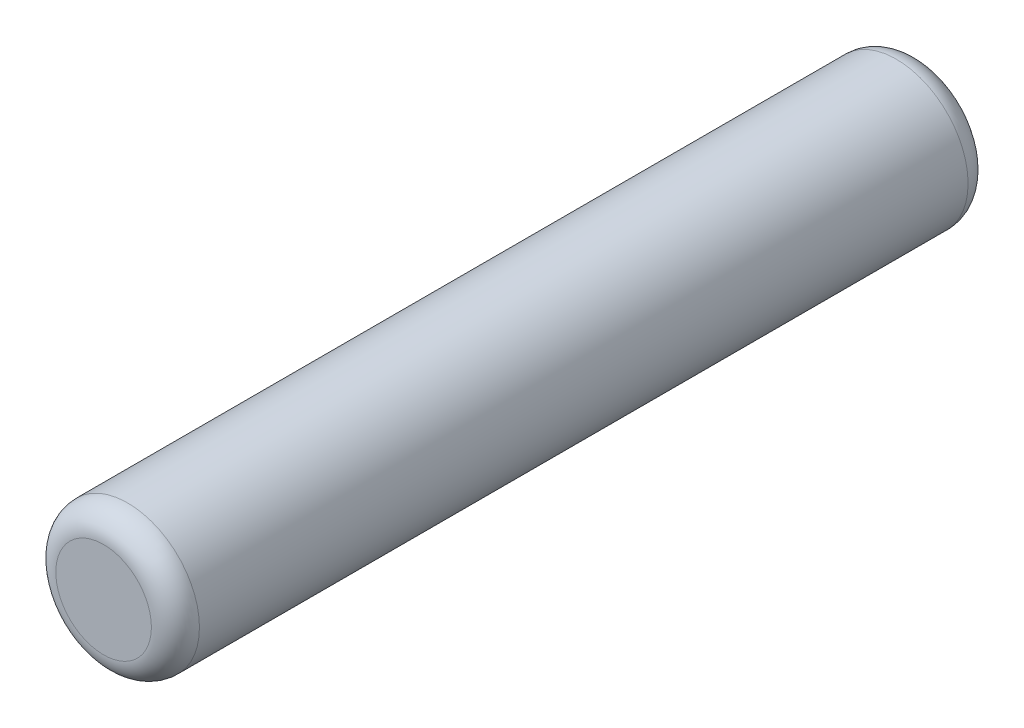
ISO-10303-21;
HEADER;
FILE_DESCRIPTION(('STEP AP214'),'2;1');
FILE_NAME('part.step','',(''),(''),'','','');
FILE_SCHEMA(('AUTOMOTIVE_DESIGN { 1 0 10303 214 1 1 1 1 }'));
ENDSEC;
DATA;
#1=APPLICATION_CONTEXT('core data for automotive mechanical design processes');
#2=APPLICATION_PROTOCOL_DEFINITION('international standard','automotive_design',2000,#1);
#3=PRODUCT_CONTEXT('',#1,'mechanical');
#4=PRODUCT('Part','Part','',(#3));
#5=PRODUCT_RELATED_PRODUCT_CATEGORY('part','',(#4));
#6=PRODUCT_DEFINITION_FORMATION('','',#4);
#7=PRODUCT_DEFINITION_CONTEXT('part definition',#1,'design');
#8=PRODUCT_DEFINITION('design','',#6,#7);
#9=PRODUCT_DEFINITION_SHAPE('','',#8);
#10=(LENGTH_UNIT() NAMED_UNIT(*) SI_UNIT(.MILLI.,.METRE.));
#11=(NAMED_UNIT(*) PLANE_ANGLE_UNIT() SI_UNIT($,.RADIAN.));
#12=(NAMED_UNIT(*) SI_UNIT($,.STERADIAN.) SOLID_ANGLE_UNIT());
#13=UNCERTAINTY_MEASURE_WITH_UNIT(LENGTH_MEASURE(1.E-05),#10,'distance_accuracy_value','');
#14=(GEOMETRIC_REPRESENTATION_CONTEXT(3) GLOBAL_UNCERTAINTY_ASSIGNED_CONTEXT((#13)) GLOBAL_UNIT_ASSIGNED_CONTEXT((#10,
#11,#12)) REPRESENTATION_CONTEXT('',''));
#15=CARTESIAN_POINT('',(0.,0.,0.));
#16=DIRECTION('',(0.,0.,1.));
#17=DIRECTION('',(1.,0.,0.));
#18=AXIS2_PLACEMENT_3D('',#15,#16,#17);
#19=CARTESIAN_POINT('',(0.,0.,-17.));
#20=DIRECTION('',(0.,0.,1.));
#21=DIRECTION('',(1.,0.,0.));
#22=AXIS2_PLACEMENT_3D('',#19,#20,#21);
#23=CYLINDRICAL_SURFACE('',#22,1.495);
#24=CARTESIAN_POINT('',(0.,0.,-16.5));
#25=DIRECTION('',(0.,0.,1.));
#26=DIRECTION('',(1.,0.,0.));
#27=AXIS2_PLACEMENT_3D('',#24,#25,#26);
#28=CIRCLE('',#27,1.495);
#29=CARTESIAN_POINT('',(1.495,0.,-16.5));
#30=VERTEX_POINT('',#29);
#31=EDGE_CURVE('E54',#30,#30,#28,.T.);
#32=ORIENTED_EDGE('',*,*,#31,.T.);
#33=EDGE_LOOP('',(#32));
#34=FACE_BOUND('',#33,.T.);
#35=CARTESIAN_POINT('',(0.,0.,-0.5));
#36=DIRECTION('',(0.,0.,1.));
#37=DIRECTION('',(1.,0.,0.));
#38=AXIS2_PLACEMENT_3D('',#35,#36,#37);
#39=CIRCLE('',#38,1.495);
#40=CARTESIAN_POINT('',(1.495,0.,-0.5));
#41=VERTEX_POINT('',#40);
#42=EDGE_CURVE('E59',#41,#41,#39,.F.);
#43=ORIENTED_EDGE('',*,*,#42,.T.);
#44=EDGE_LOOP('',(#43));
#45=FACE_BOUND('',#44,.T.);
#46=ADVANCED_FACE('F41',(#34,#45),#23,.T.);
#47=CARTESIAN_POINT('',(0.,0.,-17.));
#48=DIRECTION('',(0.,0.,1.));
#49=DIRECTION('',(1.,0.,0.));
#50=AXIS2_PLACEMENT_3D('',#47,#48,#49);
#51=PLANE('',#50);
#52=CARTESIAN_POINT('',(0.,0.,-17.));
#53=DIRECTION('',(0.,0.,1.));
#54=DIRECTION('',(1.,0.,0.));
#55=AXIS2_PLACEMENT_3D('',#52,#53,#54);
#56=CIRCLE('',#55,0.995);
#57=CARTESIAN_POINT('',(0.995,0.,-17.));
#58=VERTEX_POINT('',#57);
#59=EDGE_CURVE('E49',#58,#58,#56,.F.);
#60=ORIENTED_EDGE('',*,*,#59,.T.);
#61=EDGE_LOOP('',(#60));
#62=FACE_BOUND('',#61,.T.);
#63=ADVANCED_FACE('F76',(#62),#51,.F.);
#64=CARTESIAN_POINT('',(0.,0.,0.));
#65=DIRECTION('',(0.,0.,1.));
#66=DIRECTION('',(1.,0.,0.));
#67=AXIS2_PLACEMENT_3D('',#64,#65,#66);
#68=PLANE('',#67);
#69=CARTESIAN_POINT('',(0.,0.,0.));
#70=DIRECTION('',(0.,0.,1.));
#71=DIRECTION('',(1.,0.,0.));
#72=AXIS2_PLACEMENT_3D('',#69,#70,#71);
#73=CIRCLE('',#72,0.995);
#74=CARTESIAN_POINT('',(0.995,0.,0.));
#75=VERTEX_POINT('',#74);
#76=EDGE_CURVE('E10',#75,#75,#73,.T.);
#77=ORIENTED_EDGE('',*,*,#76,.T.);
#78=EDGE_LOOP('',(#77));
#79=FACE_BOUND('',#78,.T.);
#80=ADVANCED_FACE('F73',(#79),#68,.T.);
#81=CARTESIAN_POINT('',(0.,0.,-16.5));
#82=DIRECTION('',(0.,0.,1.));
#83=DIRECTION('',(1.,0.,0.));
#84=AXIS2_PLACEMENT_3D('',#81,#82,#83);
#85=TOROIDAL_SURFACE('',#84,0.995,0.5);
#86=ORIENTED_EDGE('',*,*,#59,.F.);
#87=EDGE_LOOP('',(#86));
#88=FACE_BOUND('',#87,.T.);
#89=ORIENTED_EDGE('',*,*,#31,.F.);
#90=EDGE_LOOP('',(#89));
#91=FACE_BOUND('',#90,.T.);
#92=ADVANCED_FACE('F69',(#88,#91),#85,.T.);
#93=CARTESIAN_POINT('',(0.,0.,-0.5));
#94=DIRECTION('',(0.,0.,1.));
#95=DIRECTION('',(1.,0.,0.));
#96=AXIS2_PLACEMENT_3D('',#93,#94,#95);
#97=TOROIDAL_SURFACE('',#96,0.995,0.5);
#98=ORIENTED_EDGE('',*,*,#42,.F.);
#99=EDGE_LOOP('',(#98));
#100=FACE_BOUND('',#99,.T.);
#101=ORIENTED_EDGE('',*,*,#76,.F.);
#102=EDGE_LOOP('',(#101));
#103=FACE_BOUND('',#102,.T.);
#104=ADVANCED_FACE('F43',(#100,#103),#97,.T.);
#105=CLOSED_SHELL('',(#46,#63,#80,#92,#104));
#106=MANIFOLD_SOLID_BREP('B2',#105);
#107=ADVANCED_BREP_SHAPE_REPRESENTATION('',(#18,#106),#14);
#108=SHAPE_DEFINITION_REPRESENTATION(#9,#107);
ENDSEC;
END-ISO-10303-21;
